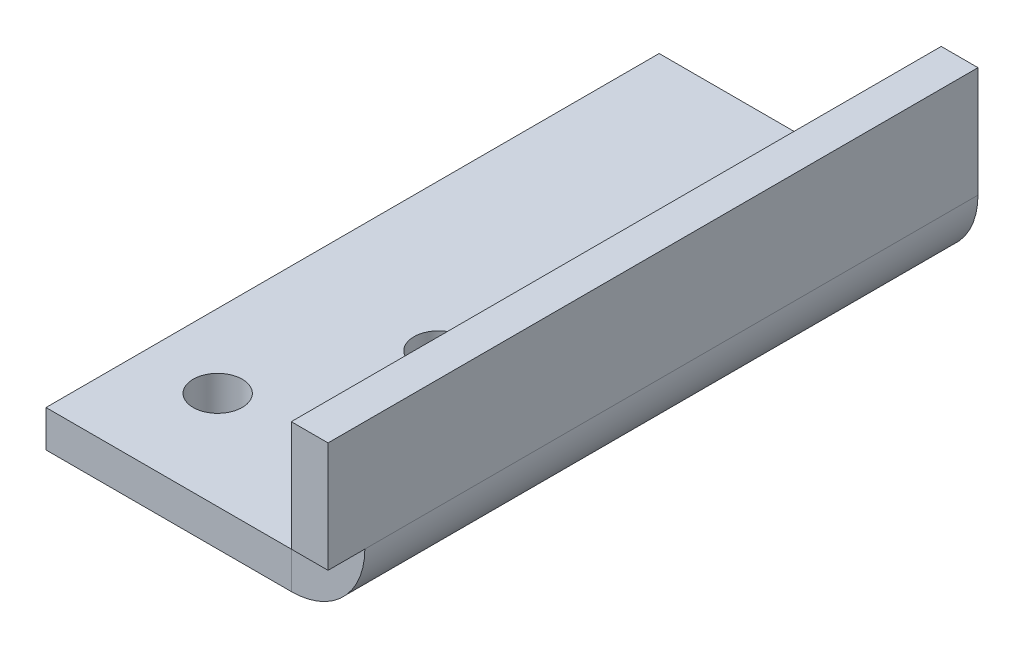
ISO-10303-21;
HEADER;
FILE_DESCRIPTION(('STEP AP214'),'2;1');
FILE_NAME('part.step','',(''),(''),'','','');
FILE_SCHEMA(('AUTOMOTIVE_DESIGN { 1 0 10303 214 1 1 1 1 }'));
ENDSEC;
DATA;
#1=APPLICATION_CONTEXT('core data for automotive mechanical design processes');
#2=APPLICATION_PROTOCOL_DEFINITION('international standard','automotive_design',2000,#1);
#3=PRODUCT_CONTEXT('',#1,'mechanical');
#4=PRODUCT('Part','Part','',(#3));
#5=PRODUCT_RELATED_PRODUCT_CATEGORY('part','',(#4));
#6=PRODUCT_DEFINITION_FORMATION('','',#4);
#7=PRODUCT_DEFINITION_CONTEXT('part definition',#1,'design');
#8=PRODUCT_DEFINITION('design','',#6,#7);
#9=PRODUCT_DEFINITION_SHAPE('','',#8);
#10=(LENGTH_UNIT() NAMED_UNIT(*) SI_UNIT(.MILLI.,.METRE.));
#11=(NAMED_UNIT(*) PLANE_ANGLE_UNIT() SI_UNIT($,.RADIAN.));
#12=(NAMED_UNIT(*) SI_UNIT($,.STERADIAN.) SOLID_ANGLE_UNIT());
#13=UNCERTAINTY_MEASURE_WITH_UNIT(LENGTH_MEASURE(1.E-05),#10,'distance_accuracy_value','');
#14=(GEOMETRIC_REPRESENTATION_CONTEXT(3) GLOBAL_UNCERTAINTY_ASSIGNED_CONTEXT((#13)) GLOBAL_UNIT_ASSIGNED_CONTEXT((#10,
#11,#12)) REPRESENTATION_CONTEXT('',''));
#15=CARTESIAN_POINT('',(0.,0.,0.));
#16=DIRECTION('',(0.,0.,1.));
#17=DIRECTION('',(1.,0.,0.));
#18=AXIS2_PLACEMENT_3D('',#15,#16,#17);
#19=CARTESIAN_POINT('',(-10.,-3.,-31.));
#20=DIRECTION('',(-1.,0.,0.));
#21=DIRECTION('',(0.,0.,-1.));
#22=AXIS2_PLACEMENT_3D('',#19,#20,#21);
#23=PLANE('',#22);
#24=DIRECTION('',(0.,0.,-1.));
#25=VECTOR('',#24,1.);
#26=CARTESIAN_POINT('',(-10.,0.,-31.));
#27=LINE('',#26,#25);
#28=CARTESIAN_POINT('',(-10.,0.,-31.));
#29=VERTEX_POINT('',#28);
#30=CARTESIAN_POINT('',(-10.,0.,-81.));
#31=VERTEX_POINT('',#30);
#32=EDGE_CURVE('E218',#29,#31,#27,.T.);
#33=ORIENTED_EDGE('',*,*,#32,.T.);
#34=DIRECTION('',(0.,1.,0.));
#35=VECTOR('',#34,1.);
#36=CARTESIAN_POINT('',(-10.,-3.,-81.));
#37=LINE('',#36,#35);
#38=CARTESIAN_POINT('',(-10.,-3.,-81.));
#39=VERTEX_POINT('',#38);
#40=EDGE_CURVE('E63',#39,#31,#37,.T.);
#41=ORIENTED_EDGE('',*,*,#40,.F.);
#42=DIRECTION('',(0.,0.,-1.));
#43=VECTOR('',#42,1.);
#44=CARTESIAN_POINT('',(-10.,-3.,-31.));
#45=LINE('',#44,#43);
#46=CARTESIAN_POINT('',(-10.,-3.,-31.));
#47=VERTEX_POINT('',#46);
#48=EDGE_CURVE('E222',#47,#39,#45,.T.);
#49=ORIENTED_EDGE('',*,*,#48,.F.);
#50=DIRECTION('',(0.,1.,0.));
#51=VECTOR('',#50,1.);
#52=CARTESIAN_POINT('',(-10.,-3.,-31.));
#53=LINE('',#52,#51);
#54=EDGE_CURVE('E13',#47,#29,#53,.T.);
#55=ORIENTED_EDGE('',*,*,#54,.T.);
#56=EDGE_LOOP('',(#33,#41,#49,#55));
#57=FACE_BOUND('',#56,.T.);
#58=ADVANCED_FACE('F60',(#57),#23,.T.);
#59=CARTESIAN_POINT('',(-10.,-3.,-31.));
#60=DIRECTION('',(0.,0.,1.));
#61=DIRECTION('',(-1.,0.,0.));
#62=AXIS2_PLACEMENT_3D('',#59,#60,#61);
#63=PLANE('',#62);
#64=DIRECTION('',(-1.,0.,0.));
#65=VECTOR('',#64,1.);
#66=CARTESIAN_POINT('',(-10.,0.,-31.));
#67=LINE('',#66,#65);
#68=CARTESIAN_POINT('',(10.,0.,-31.));
#69=VERTEX_POINT('',#68);
#70=EDGE_CURVE('E104',#69,#29,#67,.T.);
#71=ORIENTED_EDGE('',*,*,#70,.T.);
#72=ORIENTED_EDGE('',*,*,#54,.F.);
#73=DIRECTION('',(-1.,0.,0.));
#74=VECTOR('',#73,1.);
#75=CARTESIAN_POINT('',(-10.,-3.,-31.));
#76=LINE('',#75,#74);
#77=CARTESIAN_POINT('',(9.99999999999999,-3.,-31.));
#78=VERTEX_POINT('',#77);
#79=EDGE_CURVE('E79',#78,#47,#76,.T.);
#80=ORIENTED_EDGE('',*,*,#79,.F.);
#81=DIRECTION('',(0.,1.,0.));
#82=VECTOR('',#81,1.);
#83=CARTESIAN_POINT('',(10.,-3.,-31.));
#84=LINE('',#83,#82);
#85=EDGE_CURVE('E70',#78,#69,#84,.T.);
#86=ORIENTED_EDGE('',*,*,#85,.T.);
#87=EDGE_LOOP('',(#71,#72,#80,#86));
#88=FACE_BOUND('',#87,.T.);
#89=ADVANCED_FACE('F253',(#88),#63,.T.);
#90=CARTESIAN_POINT('',(-10.,-3.,-81.));
#91=DIRECTION('',(0.,0.,-1.));
#92=DIRECTION('',(1.,0.,0.));
#93=AXIS2_PLACEMENT_3D('',#90,#91,#92);
#94=PLANE('',#93);
#95=DIRECTION('',(1.,0.,0.));
#96=VECTOR('',#95,1.);
#97=CARTESIAN_POINT('',(-10.,0.,-81.));
#98=LINE('',#97,#96);
#99=CARTESIAN_POINT('',(9.99999999999999,0.,-81.));
#100=VERTEX_POINT('',#99);
#101=EDGE_CURVE('E235',#31,#100,#98,.T.);
#102=ORIENTED_EDGE('',*,*,#101,.T.);
#103=DIRECTION('',(0.,1.,0.));
#104=VECTOR('',#103,1.);
#105=CARTESIAN_POINT('',(9.99999999999999,-3.,-81.));
#106=LINE('',#105,#104);
#107=CARTESIAN_POINT('',(9.99999999999999,-3.,-81.));
#108=VERTEX_POINT('',#107);
#109=EDGE_CURVE('E174',#108,#100,#106,.T.);
#110=ORIENTED_EDGE('',*,*,#109,.F.);
#111=DIRECTION('',(1.,0.,0.));
#112=VECTOR('',#111,1.);
#113=CARTESIAN_POINT('',(-10.,-3.,-81.));
#114=LINE('',#113,#112);
#115=EDGE_CURVE('E110',#39,#108,#114,.T.);
#116=ORIENTED_EDGE('',*,*,#115,.F.);
#117=ORIENTED_EDGE('',*,*,#40,.T.);
#118=EDGE_LOOP('',(#102,#110,#116,#117));
#119=FACE_BOUND('',#118,.T.);
#120=ADVANCED_FACE('F247',(#119),#94,.T.);
#121=CARTESIAN_POINT('',(0.,-3.,-56.));
#122=DIRECTION('',(0.,1.,0.));
#123=DIRECTION('',(0.,0.,-1.));
#124=AXIS2_PLACEMENT_3D('',#121,#122,#123);
#125=PLANE('',#124);
#126=CARTESIAN_POINT('',(1.99999999999999,-3.,-51.));
#127=DIRECTION('',(0.,-1.,0.));
#128=DIRECTION('',(0.,0.,-1.));
#129=AXIS2_PLACEMENT_3D('',#126,#127,#128);
#130=CIRCLE('',#129,2.);
#131=CARTESIAN_POINT('',(1.99999999999999,-3.,-53.));
#132=VERTEX_POINT('',#131);
#133=EDGE_CURVE('E206',#132,#132,#130,.T.);
#134=ORIENTED_EDGE('',*,*,#133,.F.);
#135=EDGE_LOOP('',(#134));
#136=FACE_BOUND('',#135,.T.);
#137=CARTESIAN_POINT('',(-4.00000000000001,-3.,-39.));
#138=DIRECTION('',(0.,-1.,0.));
#139=DIRECTION('',(0.,0.,-1.));
#140=AXIS2_PLACEMENT_3D('',#137,#138,#139);
#141=CIRCLE('',#140,2.);
#142=CARTESIAN_POINT('',(-4.00000000000001,-3.,-41.));
#143=VERTEX_POINT('',#142);
#144=EDGE_CURVE('E214',#143,#143,#141,.T.);
#145=ORIENTED_EDGE('',*,*,#144,.F.);
#146=EDGE_LOOP('',(#145));
#147=FACE_BOUND('',#146,.T.);
#148=ORIENTED_EDGE('',*,*,#48,.T.);
#149=ORIENTED_EDGE('',*,*,#115,.T.);
#150=DIRECTION('',(0.,0.,1.));
#151=VECTOR('',#150,1.);
#152=CARTESIAN_POINT('',(10.,-3.,-31.));
#153=LINE('',#152,#151);
#154=EDGE_CURVE('E227',#108,#78,#153,.T.);
#155=ORIENTED_EDGE('',*,*,#154,.T.);
#156=ORIENTED_EDGE('',*,*,#79,.T.);
#157=EDGE_LOOP('',(#148,#149,#155,#156));
#158=FACE_BOUND('',#157,.T.);
#159=ADVANCED_FACE('F259',(#136,#147,#158),#125,.F.);
#160=CARTESIAN_POINT('',(0.,0.,-56.));
#161=DIRECTION('',(0.,1.,0.));
#162=DIRECTION('',(0.,0.,-1.));
#163=AXIS2_PLACEMENT_3D('',#160,#161,#162);
#164=PLANE('',#163);
#165=CARTESIAN_POINT('',(1.99999999999999,0.,-51.));
#166=DIRECTION('',(0.,-1.,0.));
#167=DIRECTION('',(0.,0.,-1.));
#168=AXIS2_PLACEMENT_3D('',#165,#166,#167);
#169=CIRCLE('',#168,2.);
#170=CARTESIAN_POINT('',(1.99999999999999,0.,-53.));
#171=VERTEX_POINT('',#170);
#172=EDGE_CURVE('E205',#171,#171,#169,.T.);
#173=ORIENTED_EDGE('',*,*,#172,.T.);
#174=EDGE_LOOP('',(#173));
#175=FACE_BOUND('',#174,.T.);
#176=CARTESIAN_POINT('',(-4.00000000000001,0.,-39.));
#177=DIRECTION('',(0.,-1.,0.));
#178=DIRECTION('',(0.,0.,-1.));
#179=AXIS2_PLACEMENT_3D('',#176,#177,#178);
#180=CIRCLE('',#179,2.);
#181=CARTESIAN_POINT('',(-4.00000000000001,0.,-41.));
#182=VERTEX_POINT('',#181);
#183=EDGE_CURVE('E210',#182,#182,#180,.T.);
#184=ORIENTED_EDGE('',*,*,#183,.T.);
#185=EDGE_LOOP('',(#184));
#186=FACE_BOUND('',#185,.T.);
#187=ORIENTED_EDGE('',*,*,#32,.F.);
#188=ORIENTED_EDGE('',*,*,#70,.F.);
#189=DIRECTION('',(0.,0.,1.));
#190=VECTOR('',#189,1.);
#191=CARTESIAN_POINT('',(10.,0.,-31.));
#192=LINE('',#191,#190);
#193=EDGE_CURVE('E238',#100,#69,#192,.T.);
#194=ORIENTED_EDGE('',*,*,#193,.F.);
#195=ORIENTED_EDGE('',*,*,#101,.F.);
#196=EDGE_LOOP('',(#187,#188,#194,#195));
#197=FACE_BOUND('',#196,.T.);
#198=ADVANCED_FACE('F252',(#175,#186,#197),#164,.T.);
#199=CARTESIAN_POINT('',(-4.00000000000001,-3.,-39.));
#200=DIRECTION('',(0.,1.,0.));
#201=DIRECTION('',(0.,0.,-1.));
#202=AXIS2_PLACEMENT_3D('',#199,#200,#201);
#203=CYLINDRICAL_SURFACE('',#202,2.);
#204=ORIENTED_EDGE('',*,*,#144,.T.);
#205=EDGE_LOOP('',(#204));
#206=FACE_BOUND('',#205,.T.);
#207=ORIENTED_EDGE('',*,*,#183,.F.);
#208=EDGE_LOOP('',(#207));
#209=FACE_BOUND('',#208,.T.);
#210=ADVANCED_FACE('F267',(#206,#209),#203,.F.);
#211=CARTESIAN_POINT('',(1.99999999999999,-3.,-51.));
#212=DIRECTION('',(0.,1.,0.));
#213=DIRECTION('',(0.,0.,-1.));
#214=AXIS2_PLACEMENT_3D('',#211,#212,#213);
#215=CYLINDRICAL_SURFACE('',#214,2.);
#216=ORIENTED_EDGE('',*,*,#133,.T.);
#217=EDGE_LOOP('',(#216));
#218=FACE_BOUND('',#217,.T.);
#219=ORIENTED_EDGE('',*,*,#172,.F.);
#220=EDGE_LOOP('',(#219));
#221=FACE_BOUND('',#220,.T.);
#222=ADVANCED_FACE('F306',(#218,#221),#215,.F.);
#223=CARTESIAN_POINT('',(9.99999999999999,3.,-81.));
#224=DIRECTION('',(0.,0.,-1.));
#225=DIRECTION('',(0.,-1.,0.));
#226=AXIS2_PLACEMENT_3D('',#223,#224,#225);
#227=PLANE('',#226);
#228=DIRECTION('',(-1.,0.,0.));
#229=VECTOR('',#228,1.);
#230=CARTESIAN_POINT('',(16.,2.99999999999998,-81.));
#231=LINE('',#230,#229);
#232=CARTESIAN_POINT('',(13.,2.99999999999999,-81.));
#233=VERTEX_POINT('',#232);
#234=CARTESIAN_POINT('',(16.,2.99999999999998,-81.));
#235=VERTEX_POINT('',#234);
#236=EDGE_CURVE('E173',#233,#235,#231,.F.);
#237=ORIENTED_EDGE('',*,*,#236,.T.);
#238=CARTESIAN_POINT('',(9.99999999999999,3.,-81.));
#239=DIRECTION('',(0.,0.,-1.));
#240=DIRECTION('',(0.,1.,0.));
#241=AXIS2_PLACEMENT_3D('',#238,#239,#240);
#242=CIRCLE('',#241,6.);
#243=EDGE_CURVE('E188',#108,#235,#242,.F.);
#244=ORIENTED_EDGE('',*,*,#243,.F.);
#245=ORIENTED_EDGE('',*,*,#109,.T.);
#246=CARTESIAN_POINT('',(9.99999999999999,3.,-81.));
#247=DIRECTION('',(0.,0.,-1.));
#248=DIRECTION('',(0.,1.,0.));
#249=AXIS2_PLACEMENT_3D('',#246,#247,#248);
#250=CIRCLE('',#249,3.);
#251=EDGE_CURVE('E163',#100,#233,#250,.F.);
#252=ORIENTED_EDGE('',*,*,#251,.T.);
#253=EDGE_LOOP('',(#237,#244,#245,#252));
#254=FACE_BOUND('',#253,.T.);
#255=ADVANCED_FACE('F172',(#254),#227,.T.);
#256=CARTESIAN_POINT('',(10.,3.00000000000001,-31.));
#257=DIRECTION('',(0.,0.,-1.));
#258=DIRECTION('',(0.,-1.,0.));
#259=AXIS2_PLACEMENT_3D('',#256,#257,#258);
#260=PLANE('',#259);
#261=CARTESIAN_POINT('',(10.,3.00000000000001,-31.));
#262=DIRECTION('',(0.,0.,-1.));
#263=DIRECTION('',(0.,1.,0.));
#264=AXIS2_PLACEMENT_3D('',#261,#262,#263);
#265=CIRCLE('',#264,3.);
#266=CARTESIAN_POINT('',(13.,2.99999999999999,-31.));
#267=VERTEX_POINT('',#266);
#268=EDGE_CURVE('E98',#267,#69,#265,.T.);
#269=ORIENTED_EDGE('',*,*,#268,.T.);
#270=ORIENTED_EDGE('',*,*,#85,.F.);
#271=CARTESIAN_POINT('',(10.,3.00000000000001,-31.));
#272=DIRECTION('',(0.,0.,-1.));
#273=DIRECTION('',(0.,1.,0.));
#274=AXIS2_PLACEMENT_3D('',#271,#272,#273);
#275=CIRCLE('',#274,6.);
#276=CARTESIAN_POINT('',(16.,2.99999999999998,-31.));
#277=VERTEX_POINT('',#276);
#278=EDGE_CURVE('E193',#277,#78,#275,.T.);
#279=ORIENTED_EDGE('',*,*,#278,.F.);
#280=DIRECTION('',(1.,0.,0.));
#281=VECTOR('',#280,1.);
#282=CARTESIAN_POINT('',(13.,2.99999999999999,-31.));
#283=LINE('',#282,#281);
#284=EDGE_CURVE('E192',#267,#277,#283,.T.);
#285=ORIENTED_EDGE('',*,*,#284,.F.);
#286=EDGE_LOOP('',(#269,#270,#279,#285));
#287=FACE_BOUND('',#286,.T.);
#288=ADVANCED_FACE('F255',(#287),#260,.F.);
#289=CARTESIAN_POINT('',(10.,3.00000000000001,-31.));
#290=DIRECTION('',(0.,0.,1.));
#291=DIRECTION('',(1.,0.,0.));
#292=AXIS2_PLACEMENT_3D('',#289,#290,#291);
#293=CYLINDRICAL_SURFACE('',#292,6.);
#294=ORIENTED_EDGE('',*,*,#154,.F.);
#295=ORIENTED_EDGE('',*,*,#243,.T.);
#296=DIRECTION('',(0.,0.,1.));
#297=VECTOR('',#296,1.);
#298=CARTESIAN_POINT('',(16.,2.99999999999998,-31.));
#299=LINE('',#298,#297);
#300=EDGE_CURVE('E177',#235,#277,#299,.T.);
#301=ORIENTED_EDGE('',*,*,#300,.T.);
#302=ORIENTED_EDGE('',*,*,#278,.T.);
#303=EDGE_LOOP('',(#294,#295,#301,#302));
#304=FACE_BOUND('',#303,.T.);
#305=ADVANCED_FACE('F258',(#304),#293,.T.);
#306=CARTESIAN_POINT('',(10.,3.00000000000001,-31.));
#307=DIRECTION('',(0.,0.,1.));
#308=DIRECTION('',(1.,0.,0.));
#309=AXIS2_PLACEMENT_3D('',#306,#307,#308);
#310=CYLINDRICAL_SURFACE('',#309,3.);
#311=ORIENTED_EDGE('',*,*,#193,.T.);
#312=ORIENTED_EDGE('',*,*,#268,.F.);
#313=DIRECTION('',(0.,0.,1.));
#314=VECTOR('',#313,1.);
#315=CARTESIAN_POINT('',(13.,2.99999999999999,-81.));
#316=LINE('',#315,#314);
#317=EDGE_CURVE('E151',#233,#267,#316,.T.);
#318=ORIENTED_EDGE('',*,*,#317,.F.);
#319=ORIENTED_EDGE('',*,*,#251,.F.);
#320=EDGE_LOOP('',(#311,#312,#318,#319));
#321=FACE_BOUND('',#320,.T.);
#322=ADVANCED_FACE('F162',(#321),#310,.F.);
#323=CARTESIAN_POINT('',(13.,2.99999999999999,-81.));
#324=DIRECTION('',(0.,-1.,0.));
#325=DIRECTION('',(1.,0.,0.));
#326=AXIS2_PLACEMENT_3D('',#323,#324,#325);
#327=PLANE('',#326);
#328=ORIENTED_EDGE('',*,*,#284,.T.);
#329=DIRECTION('',(0.,0.,1.));
#330=VECTOR('',#329,1.);
#331=CARTESIAN_POINT('',(16.,2.99999999999998,-81.));
#332=LINE('',#331,#330);
#333=CARTESIAN_POINT('',(16.,2.99999999999998,-28.));
#334=VERTEX_POINT('',#333);
#335=EDGE_CURVE('E454',#334,#277,#332,.F.);
#336=ORIENTED_EDGE('',*,*,#335,.F.);
#337=DIRECTION('',(-1.,0.,0.));
#338=VECTOR('',#337,1.);
#339=CARTESIAN_POINT('',(13.,2.99999999999999,-28.));
#340=LINE('',#339,#338);
#341=CARTESIAN_POINT('',(13.,2.99999999999999,-28.));
#342=VERTEX_POINT('',#341);
#343=EDGE_CURVE('E166',#342,#334,#340,.F.);
#344=ORIENTED_EDGE('',*,*,#343,.F.);
#345=EDGE_CURVE('E167',#267,#342,#316,.T.);
#346=ORIENTED_EDGE('',*,*,#345,.F.);
#347=EDGE_LOOP('',(#328,#336,#344,#346));
#348=FACE_BOUND('',#347,.T.);
#349=ADVANCED_FACE('F353',(#348),#327,.T.);
#350=CARTESIAN_POINT('',(16.,12.,-28.));
#351=DIRECTION('',(0.,0.,-1.));
#352=DIRECTION('',(1.,0.,0.));
#353=AXIS2_PLACEMENT_3D('',#350,#351,#352);
#354=PLANE('',#353);
#355=ORIENTED_EDGE('',*,*,#343,.T.);
#356=DIRECTION('',(0.,1.,0.));
#357=VECTOR('',#356,1.);
#358=CARTESIAN_POINT('',(16.,0.,-28.));
#359=LINE('',#358,#357);
#360=CARTESIAN_POINT('',(16.,12.,-28.));
#361=VERTEX_POINT('',#360);
#362=EDGE_CURVE('E158',#334,#361,#359,.T.);
#363=ORIENTED_EDGE('',*,*,#362,.T.);
#364=DIRECTION('',(-1.,0.,0.));
#365=VECTOR('',#364,1.);
#366=CARTESIAN_POINT('',(16.,12.,-28.));
#367=LINE('',#366,#365);
#368=CARTESIAN_POINT('',(13.,12.,-28.));
#369=VERTEX_POINT('',#368);
#370=EDGE_CURVE('E201',#361,#369,#367,.T.);
#371=ORIENTED_EDGE('',*,*,#370,.T.);
#372=DIRECTION('',(0.,-1.,0.));
#373=VECTOR('',#372,1.);
#374=CARTESIAN_POINT('',(13.,12.,-28.));
#375=LINE('',#374,#373);
#376=EDGE_CURVE('E449',#342,#369,#375,.F.);
#377=ORIENTED_EDGE('',*,*,#376,.F.);
#378=EDGE_LOOP('',(#355,#363,#371,#377));
#379=FACE_BOUND('',#378,.T.);
#380=ADVANCED_FACE('F363',(#379),#354,.F.);
#381=CARTESIAN_POINT('',(16.,0.,-81.));
#382=DIRECTION('',(0.,0.,1.));
#383=DIRECTION('',(-1.,0.,0.));
#384=AXIS2_PLACEMENT_3D('',#381,#382,#383);
#385=PLANE('',#384);
#386=ORIENTED_EDGE('',*,*,#236,.F.);
#387=DIRECTION('',(0.,1.,0.));
#388=VECTOR('',#387,1.);
#389=CARTESIAN_POINT('',(13.,0.,-81.));
#390=LINE('',#389,#388);
#391=CARTESIAN_POINT('',(13.,12.,-81.));
#392=VERTEX_POINT('',#391);
#393=EDGE_CURVE('E146',#392,#233,#390,.F.);
#394=ORIENTED_EDGE('',*,*,#393,.F.);
#395=DIRECTION('',(-1.,0.,0.));
#396=VECTOR('',#395,1.);
#397=CARTESIAN_POINT('',(16.,12.,-81.));
#398=LINE('',#397,#396);
#399=CARTESIAN_POINT('',(16.,12.,-81.));
#400=VERTEX_POINT('',#399);
#401=EDGE_CURVE('E447',#400,#392,#398,.T.);
#402=ORIENTED_EDGE('',*,*,#401,.F.);
#403=DIRECTION('',(0.,-1.,0.));
#404=VECTOR('',#403,1.);
#405=CARTESIAN_POINT('',(16.,0.,-81.));
#406=LINE('',#405,#404);
#407=EDGE_CURVE('E181',#400,#235,#406,.T.);
#408=ORIENTED_EDGE('',*,*,#407,.T.);
#409=EDGE_LOOP('',(#386,#394,#402,#408));
#410=FACE_BOUND('',#409,.T.);
#411=ADVANCED_FACE('F179',(#410),#385,.F.);
#412=CARTESIAN_POINT('',(16.,0.,-56.));
#413=DIRECTION('',(-1.,0.,0.));
#414=DIRECTION('',(0.,-1.,0.));
#415=AXIS2_PLACEMENT_3D('',#412,#413,#414);
#416=PLANE('',#415);
#417=ORIENTED_EDGE('',*,*,#335,.T.);
#418=ORIENTED_EDGE('',*,*,#300,.F.);
#419=ORIENTED_EDGE('',*,*,#407,.F.);
#420=DIRECTION('',(0.,0.,-1.));
#421=VECTOR('',#420,1.);
#422=CARTESIAN_POINT('',(16.,12.,-56.));
#423=LINE('',#422,#421);
#424=EDGE_CURVE('E463',#361,#400,#423,.T.);
#425=ORIENTED_EDGE('',*,*,#424,.F.);
#426=ORIENTED_EDGE('',*,*,#362,.F.);
#427=EDGE_LOOP('',(#417,#418,#419,#425,#426));
#428=FACE_BOUND('',#427,.T.);
#429=ADVANCED_FACE('F384',(#428),#416,.F.);
#430=CARTESIAN_POINT('',(13.,0.,-56.));
#431=DIRECTION('',(-1.,0.,0.));
#432=DIRECTION('',(0.,-1.,0.));
#433=AXIS2_PLACEMENT_3D('',#430,#431,#432);
#434=PLANE('',#433);
#435=ORIENTED_EDGE('',*,*,#376,.T.);
#436=DIRECTION('',(0.,0.,1.));
#437=VECTOR('',#436,1.);
#438=CARTESIAN_POINT('',(13.,12.,-81.));
#439=LINE('',#438,#437);
#440=EDGE_CURVE('E152',#369,#392,#439,.F.);
#441=ORIENTED_EDGE('',*,*,#440,.T.);
#442=ORIENTED_EDGE('',*,*,#393,.T.);
#443=ORIENTED_EDGE('',*,*,#317,.T.);
#444=ORIENTED_EDGE('',*,*,#345,.T.);
#445=EDGE_LOOP('',(#435,#441,#442,#443,#444));
#446=FACE_BOUND('',#445,.T.);
#447=ADVANCED_FACE('F149',(#446),#434,.T.);
#448=CARTESIAN_POINT('',(16.,12.,-81.));
#449=DIRECTION('',(0.,-1.,0.));
#450=DIRECTION('',(1.,0.,0.));
#451=AXIS2_PLACEMENT_3D('',#448,#449,#450);
#452=PLANE('',#451);
#453=ORIENTED_EDGE('',*,*,#440,.F.);
#454=ORIENTED_EDGE('',*,*,#370,.F.);
#455=ORIENTED_EDGE('',*,*,#424,.T.);
#456=ORIENTED_EDGE('',*,*,#401,.T.);
#457=EDGE_LOOP('',(#453,#454,#455,#456));
#458=FACE_BOUND('',#457,.T.);
#459=ADVANCED_FACE('F404',(#458),#452,.F.);
#460=CLOSED_SHELL('',(#58,#89,#120,#159,#198,#210,#222,#255,#288,#305,#322,#349,#380,#411,#429,
#447,#459));
#461=MANIFOLD_SOLID_BREP('B2',#460);
#462=ADVANCED_BREP_SHAPE_REPRESENTATION('',(#18,#461),#14);
#463=SHAPE_DEFINITION_REPRESENTATION(#9,#462);
ENDSEC;
END-ISO-10303-21;
